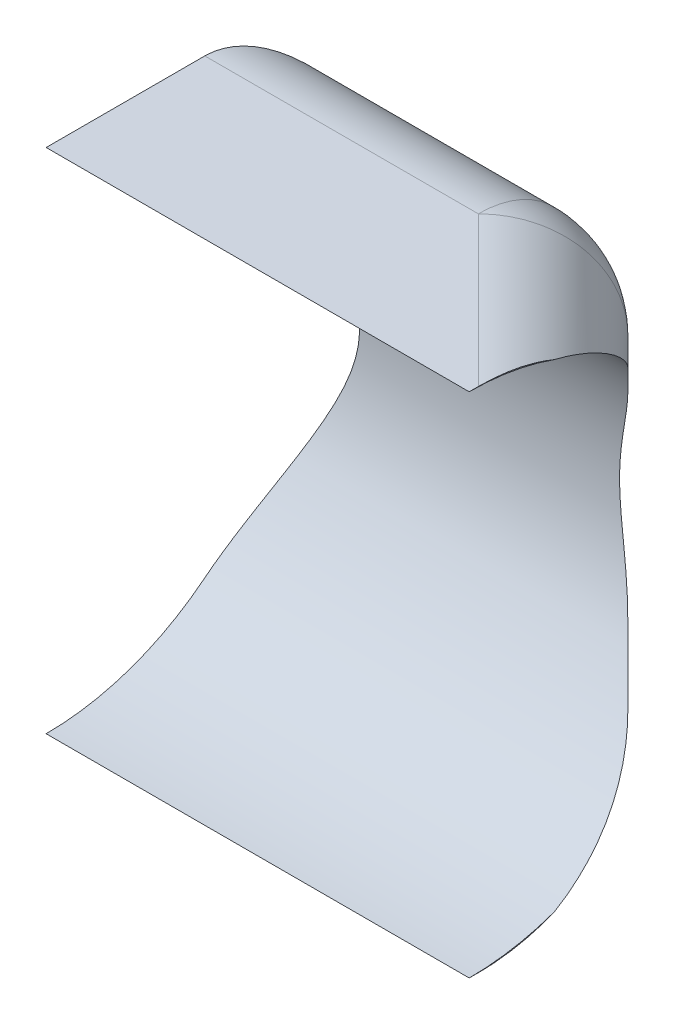
ISO-10303-21;
HEADER;
FILE_DESCRIPTION(('STEP AP214'),'2;1');
FILE_NAME('part.step','',(''),(''),'','','');
FILE_SCHEMA(('AUTOMOTIVE_DESIGN { 1 0 10303 214 1 1 1 1 }'));
ENDSEC;
DATA;
#1=APPLICATION_CONTEXT('core data for automotive mechanical design processes');
#2=APPLICATION_PROTOCOL_DEFINITION('international standard','automotive_design',2000,#1);
#3=PRODUCT_CONTEXT('',#1,'mechanical');
#4=PRODUCT('Part','Part','',(#3));
#5=PRODUCT_RELATED_PRODUCT_CATEGORY('part','',(#4));
#6=PRODUCT_DEFINITION_FORMATION('','',#4);
#7=PRODUCT_DEFINITION_CONTEXT('part definition',#1,'design');
#8=PRODUCT_DEFINITION('design','',#6,#7);
#9=PRODUCT_DEFINITION_SHAPE('','',#8);
#10=(LENGTH_UNIT() NAMED_UNIT(*) SI_UNIT(.MILLI.,.METRE.));
#11=(NAMED_UNIT(*) PLANE_ANGLE_UNIT() SI_UNIT($,.RADIAN.));
#12=(NAMED_UNIT(*) SI_UNIT($,.STERADIAN.) SOLID_ANGLE_UNIT());
#13=UNCERTAINTY_MEASURE_WITH_UNIT(LENGTH_MEASURE(1.E-05),#10,'distance_accuracy_value','');
#14=(GEOMETRIC_REPRESENTATION_CONTEXT(3) GLOBAL_UNCERTAINTY_ASSIGNED_CONTEXT((#13)) GLOBAL_UNIT_ASSIGNED_CONTEXT((#10,
#11,#12)) REPRESENTATION_CONTEXT('',''));
#15=CARTESIAN_POINT('',(0.,0.,0.));
#16=DIRECTION('',(0.,0.,1.));
#17=DIRECTION('',(1.,0.,0.));
#18=AXIS2_PLACEMENT_3D('',#15,#16,#17);
#19=CARTESIAN_POINT('',(40.,0.,10.0000000000002));
#20=DIRECTION('',(-0.707106781186551,0.,0.707106781186544));
#21=DIRECTION('',(0.,1.,0.));
#22=AXIS2_PLACEMENT_3D('',#19,#20,#21);
#23=PLANE('',#22);
#24=DIRECTION('',(0.707106781186544,0.,0.707106781186551));
#25=VECTOR('',#24,1.);
#26=CARTESIAN_POINT('',(29.9999999999999,-38.,0.));
#27=LINE('',#26,#25);
#28=CARTESIAN_POINT('',(35.5064113103819,-38.,5.50641131038207));
#29=VERTEX_POINT('',#28);
#30=CARTESIAN_POINT('',(32.9289321881345,-38.,2.92893218813456));
#31=VERTEX_POINT('',#30);
#32=EDGE_CURVE('E209',#29,#31,#27,.F.);
#33=ORIENTED_EDGE('',*,*,#32,.T.);
#34=DIRECTION('',(0.,-1.,0.));
#35=VECTOR('',#34,1.);
#36=CARTESIAN_POINT('',(32.9289321881345,-10.,2.92893218813456));
#37=LINE('',#36,#35);
#38=CARTESIAN_POINT('',(32.9289321881345,-33.4269807278914,2.92893218813456));
#39=VERTEX_POINT('',#38);
#40=EDGE_CURVE('E239',#31,#39,#37,.F.);
#41=ORIENTED_EDGE('',*,*,#40,.T.);
#42=CARTESIAN_POINT('',(54.9999999999997,-24.,25.));
#43=DIRECTION('',(-0.707106781186551,0.,0.707106781186544));
#44=DIRECTION('',(0.707106781186544,0.,0.707106781186551));
#45=AXIS2_PLACEMENT_3D('',#42,#43,#44);
#46=ELLIPSE('',#45,33.9411254969541,24.);
#47=EDGE_CURVE('E302',#29,#39,#46,.F.);
#48=ORIENTED_EDGE('',*,*,#47,.F.);
#49=EDGE_LOOP('',(#33,#41,#48));
#50=FACE_BOUND('',#49,.T.);
#51=ADVANCED_FACE('F37',(#50),#23,.F.);
#52=CARTESIAN_POINT('',(40.,0.,25.));
#53=DIRECTION('',(-1.,0.,0.));
#54=DIRECTION('',(0.,-1.,0.));
#55=AXIS2_PLACEMENT_3D('',#52,#53,#54);
#56=PLANE('',#55);
#57=DIRECTION('',(0.,0.,-1.));
#58=VECTOR('',#57,1.);
#59=CARTESIAN_POINT('',(40.,-48.,25.));
#60=LINE('',#59,#58);
#61=CARTESIAN_POINT('',(40.,-48.,25.));
#62=VERTEX_POINT('',#61);
#63=CARTESIAN_POINT('',(40.,-48.,24.1421356237312));
#64=VERTEX_POINT('',#63);
#65=EDGE_CURVE('E155',#62,#64,#60,.T.);
#66=ORIENTED_EDGE('',*,*,#65,.T.);
#67=CARTESIAN_POINT('',(40.,-38.,24.1421356237312));
#68=DIRECTION('',(-1.,0.,0.));
#69=DIRECTION('',(0.,0.,1.));
#70=AXIS2_PLACEMENT_3D('',#67,#68,#69);
#71=ELLIPSE('',#70,14.142135623731,10.);
#72=CARTESIAN_POINT('',(40.,-46.606308582722,16.9405451634276));
#73=VERTEX_POINT('',#72);
#74=EDGE_CURVE('E210',#64,#73,#71,.F.);
#75=ORIENTED_EDGE('',*,*,#74,.T.);
#76=CARTESIAN_POINT('',(40.,-24.,25.));
#77=DIRECTION('',(1.,0.,0.));
#78=DIRECTION('',(0.,-1.,0.));
#79=AXIS2_PLACEMENT_3D('',#76,#77,#78);
#80=CIRCLE('',#79,24.);
#81=EDGE_CURVE('E138',#62,#73,#80,.T.);
#82=ORIENTED_EDGE('',*,*,#81,.F.);
#83=EDGE_LOOP('',(#66,#75,#82));
#84=FACE_BOUND('',#83,.T.);
#85=ADVANCED_FACE('F314',(#84),#56,.F.);
#86=CARTESIAN_POINT('',(0.,0.,25.));
#87=DIRECTION('',(1.,0.,0.));
#88=DIRECTION('',(0.,0.,-1.));
#89=AXIS2_PLACEMENT_3D('',#86,#87,#88);
#90=PLANE('',#89);
#91=DIRECTION('',(0.,0.,-1.));
#92=VECTOR('',#91,1.);
#93=CARTESIAN_POINT('',(0.,0.,25.));
#94=LINE('',#93,#92);
#95=CARTESIAN_POINT('',(0.,0.,25.));
#96=VERTEX_POINT('',#95);
#97=CARTESIAN_POINT('',(0.,0.,10.));
#98=VERTEX_POINT('',#97);
#99=EDGE_CURVE('E133',#96,#98,#94,.T.);
#100=ORIENTED_EDGE('',*,*,#99,.T.);
#101=DIRECTION('',(0.,-1.,0.));
#102=VECTOR('',#101,1.);
#103=CARTESIAN_POINT('',(0.,0.,10.));
#104=LINE('',#103,#102);
#105=CARTESIAN_POINT('',(0.,-5.26500600480482,10.));
#106=VERTEX_POINT('',#105);
#107=EDGE_CURVE('E135',#98,#106,#104,.T.);
#108=ORIENTED_EDGE('',*,*,#107,.T.);
#109=CARTESIAN_POINT('',(0.,-24.,25.));
#110=DIRECTION('',(1.,0.,0.));
#111=DIRECTION('',(0.,-1.,0.));
#112=AXIS2_PLACEMENT_3D('',#109,#110,#111);
#113=CIRCLE('',#112,24.);
#114=EDGE_CURVE('E129',#106,#96,#113,.T.);
#115=ORIENTED_EDGE('',*,*,#114,.T.);
#116=EDGE_LOOP('',(#100,#108,#115));
#117=FACE_BOUND('',#116,.T.);
#118=ADVANCED_FACE('F131',(#117),#90,.F.);
#119=CARTESIAN_POINT('',(0.,-48.,25.));
#120=VERTEX_POINT('',#119);
#121=CARTESIAN_POINT('',(0.,-42.7349939951952,10.));
#122=VERTEX_POINT('',#121);
#123=EDGE_CURVE('E137',#120,#122,#113,.T.);
#124=ORIENTED_EDGE('',*,*,#123,.T.);
#125=DIRECTION('',(0.,-1.,0.));
#126=VECTOR('',#125,1.);
#127=CARTESIAN_POINT('',(0.,0.,10.));
#128=LINE('',#127,#126);
#129=CARTESIAN_POINT('',(0.,-48.,10.));
#130=VERTEX_POINT('',#129);
#131=EDGE_CURVE('E164',#122,#130,#128,.T.);
#132=ORIENTED_EDGE('',*,*,#131,.T.);
#133=DIRECTION('',(0.,0.,-1.));
#134=VECTOR('',#133,1.);
#135=CARTESIAN_POINT('',(0.,-48.,25.));
#136=LINE('',#135,#134);
#137=EDGE_CURVE('E161',#120,#130,#136,.T.);
#138=ORIENTED_EDGE('',*,*,#137,.F.);
#139=EDGE_LOOP('',(#124,#132,#138));
#140=FACE_BOUND('',#139,.T.);
#141=ADVANCED_FACE('F271',(#140),#90,.F.);
#142=CARTESIAN_POINT('',(0.,-48.,25.));
#143=DIRECTION('',(0.,1.,0.));
#144=DIRECTION('',(0.,0.,1.));
#145=AXIS2_PLACEMENT_3D('',#142,#143,#144);
#146=PLANE('',#145);
#147=ORIENTED_EDGE('',*,*,#137,.T.);
#148=DIRECTION('',(1.,0.,0.));
#149=VECTOR('',#148,1.);
#150=CARTESIAN_POINT('',(0.,-48.,10.));
#151=LINE('',#150,#149);
#152=CARTESIAN_POINT('',(25.8578643762689,-48.,10.));
#153=VERTEX_POINT('',#152);
#154=EDGE_CURVE('E242',#130,#153,#151,.T.);
#155=ORIENTED_EDGE('',*,*,#154,.T.);
#156=DIRECTION('',(-0.707106781186544,0.,-0.707106781186551));
#157=VECTOR('',#156,1.);
#158=CARTESIAN_POINT('',(32.9289321881345,-48.,17.0710678118656));
#159=LINE('',#158,#157);
#160=EDGE_CURVE('E285',#153,#64,#159,.F.);
#161=ORIENTED_EDGE('',*,*,#160,.T.);
#162=ORIENTED_EDGE('',*,*,#65,.F.);
#163=DIRECTION('',(1.,0.,0.));
#164=VECTOR('',#163,1.);
#165=CARTESIAN_POINT('',(0.,-48.,25.));
#166=LINE('',#165,#164);
#167=EDGE_CURVE('E149',#120,#62,#166,.T.);
#168=ORIENTED_EDGE('',*,*,#167,.F.);
#169=EDGE_LOOP('',(#147,#155,#161,#162,#168));
#170=FACE_BOUND('',#169,.T.);
#171=ADVANCED_FACE('F283',(#170),#146,.F.);
#172=CARTESIAN_POINT('',(40.,-1.39369141727854,16.9405451634263));
#173=VERTEX_POINT('',#172);
#174=CARTESIAN_POINT('',(40.,0.,25.));
#175=VERTEX_POINT('',#174);
#176=EDGE_CURVE('E145',#173,#175,#80,.T.);
#177=ORIENTED_EDGE('',*,*,#176,.F.);
#178=CARTESIAN_POINT('',(40.,-10.,24.1421356237312));
#179=DIRECTION('',(-1.,0.,0.));
#180=DIRECTION('',(0.,0.,-1.));
#181=AXIS2_PLACEMENT_3D('',#178,#179,#180);
#182=ELLIPSE('',#181,14.142135623731,10.);
#183=CARTESIAN_POINT('',(40.,0.,24.1421356237312));
#184=VERTEX_POINT('',#183);
#185=EDGE_CURVE('E293',#173,#184,#182,.F.);
#186=ORIENTED_EDGE('',*,*,#185,.T.);
#187=DIRECTION('',(0.,0.,-1.));
#188=VECTOR('',#187,1.);
#189=CARTESIAN_POINT('',(40.,0.,25.));
#190=LINE('',#189,#188);
#191=EDGE_CURVE('E153',#175,#184,#190,.T.);
#192=ORIENTED_EDGE('',*,*,#191,.F.);
#193=EDGE_LOOP('',(#177,#186,#192));
#194=FACE_BOUND('',#193,.T.);
#195=ADVANCED_FACE('F321',(#194),#56,.F.);
#196=CARTESIAN_POINT('',(0.,0.,25.));
#197=DIRECTION('',(0.,-1.,0.));
#198=DIRECTION('',(0.,0.,-1.));
#199=AXIS2_PLACEMENT_3D('',#196,#197,#198);
#200=PLANE('',#199);
#201=DIRECTION('',(0.707106781186544,0.,0.707106781186551));
#202=VECTOR('',#201,1.);
#203=CARTESIAN_POINT('',(22.9289321881344,0.,7.07106781186544));
#204=LINE('',#203,#202);
#205=CARTESIAN_POINT('',(25.8578643762689,0.,10.));
#206=VERTEX_POINT('',#205);
#207=EDGE_CURVE('E305',#184,#206,#204,.F.);
#208=ORIENTED_EDGE('',*,*,#207,.T.);
#209=DIRECTION('',(-1.,0.,0.));
#210=VECTOR('',#209,1.);
#211=CARTESIAN_POINT('',(0.,0.,10.));
#212=LINE('',#211,#210);
#213=EDGE_CURVE('E45',#206,#98,#212,.T.);
#214=ORIENTED_EDGE('',*,*,#213,.T.);
#215=ORIENTED_EDGE('',*,*,#99,.F.);
#216=DIRECTION('',(-1.,0.,0.));
#217=VECTOR('',#216,1.);
#218=CARTESIAN_POINT('',(0.,0.,25.));
#219=LINE('',#218,#217);
#220=EDGE_CURVE('E141',#175,#96,#219,.T.);
#221=ORIENTED_EDGE('',*,*,#220,.F.);
#222=ORIENTED_EDGE('',*,*,#191,.T.);
#223=EDGE_LOOP('',(#208,#214,#215,#221,#222));
#224=FACE_BOUND('',#223,.T.);
#225=ADVANCED_FACE('F151',(#224),#200,.F.);
#226=CARTESIAN_POINT('',(0.,0.,0.));
#227=DIRECTION('',(0.,0.,1.));
#228=DIRECTION('',(1.,0.,0.));
#229=AXIS2_PLACEMENT_3D('',#226,#227,#228);
#230=PLANE('',#229);
#231=CARTESIAN_POINT('',(17.9289321881345,-24.,0.));
#232=DIRECTION('',(0.,0.,1.));
#233=DIRECTION('',(1.,0.,0.));
#234=AXIS2_PLACEMENT_3D('',#231,#232,#233);
#235=CIRCLE('',#234,5.);
#236=CARTESIAN_POINT('',(22.9289321881345,-24.,0.));
#237=VERTEX_POINT('',#236);
#238=EDGE_CURVE('E11',#237,#237,#235,.F.);
#239=ORIENTED_EDGE('',*,*,#238,.F.);
#240=EDGE_LOOP('',(#239));
#241=FACE_BOUND('',#240,.T.);
#242=DIRECTION('',(0.,1.,0.));
#243=VECTOR('',#242,1.);
#244=CARTESIAN_POINT('',(25.857864376269,-38.,0.));
#245=LINE('',#244,#243);
#246=CARTESIAN_POINT('',(25.8578643762689,-10.,0.));
#247=VERTEX_POINT('',#246);
#248=CARTESIAN_POINT('',(25.857864376269,-38.,0.));
#249=VERTEX_POINT('',#248);
#250=EDGE_CURVE('E296',#247,#249,#245,.F.);
#251=ORIENTED_EDGE('',*,*,#250,.T.);
#252=DIRECTION('',(1.,0.,0.));
#253=VECTOR('',#252,1.);
#254=CARTESIAN_POINT('',(0.,-38.,0.));
#255=LINE('',#254,#253);
#256=CARTESIAN_POINT('',(10.,-38.,0.));
#257=VERTEX_POINT('',#256);
#258=EDGE_CURVE('E279',#249,#257,#255,.F.);
#259=ORIENTED_EDGE('',*,*,#258,.T.);
#260=DIRECTION('',(0.,-1.,0.));
#261=VECTOR('',#260,1.);
#262=CARTESIAN_POINT('',(10.,0.,0.));
#263=LINE('',#262,#261);
#264=CARTESIAN_POINT('',(10.,-10.,0.));
#265=VERTEX_POINT('',#264);
#266=EDGE_CURVE('E175',#257,#265,#263,.F.);
#267=ORIENTED_EDGE('',*,*,#266,.T.);
#268=DIRECTION('',(-1.,0.,0.));
#269=VECTOR('',#268,1.);
#270=CARTESIAN_POINT('',(0.,-10.,0.));
#271=LINE('',#270,#269);
#272=EDGE_CURVE('E295',#265,#247,#271,.F.);
#273=ORIENTED_EDGE('',*,*,#272,.T.);
#274=EDGE_LOOP('',(#251,#259,#267,#273));
#275=FACE_BOUND('',#274,.T.);
#276=ADVANCED_FACE('F185',(#241,#275),#230,.F.);
#277=CARTESIAN_POINT('',(0.,-24.,25.));
#278=DIRECTION('',(1.,0.,0.));
#279=DIRECTION('',(0.,1.,0.));
#280=AXIS2_PLACEMENT_3D('',#277,#278,#279);
#281=CYLINDRICAL_SURFACE('',#280,24.);
#282=ORIENTED_EDGE('',*,*,#47,.T.);
#283=CARTESIAN_POINT('',(32.9289321881345,-33.4269807278915,2.92893218813456));
#284=CARTESIAN_POINT('',(32.8271329097532,-33.188588504213,2.82711807834623));
#285=CARTESIAN_POINT('',(32.7248337224918,-32.9487334808352,2.72923062427731));
#286=CARTESIAN_POINT('',(32.520193896018,-32.4659766100525,2.54127270448154));
#287=CARTESIAN_POINT('',(32.4178532545388,-32.2230745651148,2.45120274857776));
#288=CARTESIAN_POINT('',(32.2137419905237,-31.733268582962,2.27855190161104));
#289=CARTESIAN_POINT('',(32.1119746654923,-31.4863535280337,2.19599863263588));
#290=CARTESIAN_POINT('',(31.9105305691383,-30.9891938296239,2.03874676631367));
#291=CARTESIAN_POINT('',(31.8108537586694,-30.7389492486334,1.96404802178074));
#292=CARTESIAN_POINT('',(31.6118479267749,-30.2269755164486,1.82031757972945));
#293=CARTESIAN_POINT('',(31.5126284245789,-29.9651326870697,1.75153798095842));
#294=CARTESIAN_POINT('',(31.319603478024,-29.4373923599183,1.62247760525228));
#295=CARTESIAN_POINT('',(31.2257977092619,-29.1714951063056,1.56219631876579));
#296=CARTESIAN_POINT('',(31.0458300795816,-28.6356869755569,1.45036727790365));
#297=CARTESIAN_POINT('',(30.9596583995698,-28.3657817912861,1.39880822481741));
#298=CARTESIAN_POINT('',(30.7973581022885,-27.8214745820247,1.30458689616222));
#299=CARTESIAN_POINT('',(30.7212273587771,-27.5470735229489,1.26192273591971));
#300=CARTESIAN_POINT('',(30.5689633486335,-26.9423996767947,1.17875215635276));
#301=CARTESIAN_POINT('',(30.4954429025372,-26.6111945096894,1.14011001298408));
#302=CARTESIAN_POINT('',(30.3717278909255,-25.9431294561521,1.07643957527415));
#303=CARTESIAN_POINT('',(30.3215281076734,-25.606270852106,1.05140823545449));
#304=CARTESIAN_POINT('',(30.2494487803043,-24.9331530547882,1.0158122958291));
#305=CARTESIAN_POINT('',(30.2272075559737,-24.5969436045016,1.00506283542024));
#306=CARTESIAN_POINT('',(30.2121469827101,-23.9237017438229,0.997760909898105));
#307=CARTESIAN_POINT('',(30.219326491263,-23.5866693658961,1.00120789348532));
#308=CARTESIAN_POINT('',(30.262301019486,-22.9154899839812,1.02216786589501));
#309=CARTESIAN_POINT('',(30.298049381879,-22.581339172612,1.0396579204683));
#310=CARTESIAN_POINT('',(30.3946507613719,-21.9177160661213,1.08818539303226));
#311=CARTESIAN_POINT('',(30.4555094888187,-21.5882448528276,1.11922589262218));
#312=CARTESIAN_POINT('',(30.598408985083,-20.9312743056624,1.19467186024196));
#313=CARTESIAN_POINT('',(30.6807019647998,-20.6038495223493,1.23923758404605));
#314=CARTESIAN_POINT('',(30.8610980570349,-19.9553450217789,1.34099423644651));
#315=CARTESIAN_POINT('',(30.9592068022933,-19.6342676110271,1.39818966577029));
#316=CARTESIAN_POINT('',(31.1997549538539,-18.8972632394805,1.54483705497679));
#317=CARTESIAN_POINT('',(31.3463771071436,-18.4836018852926,1.63876429431312));
#318=CARTESIAN_POINT('',(31.6513541833573,-17.6658323050783,1.84710785177903));
#319=CARTESIAN_POINT('',(31.8097128967353,-17.2617272214272,1.96153080628374));
#320=CARTESIAN_POINT('',(32.1280142330554,-16.4724700644875,2.20739903498151));
#321=CARTESIAN_POINT('',(32.2878103475166,-16.0870980377461,2.33832841969417));
#322=CARTESIAN_POINT('',(32.5283117991787,-15.5149225590136,2.54906007340941));
#323=CARTESIAN_POINT('',(32.6085811996764,-15.3252525839467,2.62166162309101));
#324=CARTESIAN_POINT('',(32.7689747852565,-14.9477622013626,2.77167973495386));
#325=CARTESIAN_POINT('',(32.8490989689936,-14.7599418109092,2.84909634150942));
#326=CARTESIAN_POINT('',(32.9289321881345,-14.5730192721085,2.92893218813456));
#327=B_SPLINE_CURVE_WITH_KNOTS('',3,(#283,#284,#285,#286,#287,#288,#289,#290,#291,#292,#293,
#294,#295,#296,#297,#298,#299,#300,#301,#302,#303,#304,#305,#306,#307,#308,#309,#310,#311,#312,
#313,#314,#315,#316,#317,#318,#319,#320,#321,#322,#323,#324,#325,#326),.UNSPECIFIED.,.F.,.F.,(4,
2,2,2,2,2,2,2,2,2,2,2,2,2,2,2,2,2,2,2,2,4),(0.,0.835455824701549,1.67096609330822,
2.50943222562282,3.34788264312528,4.21270114558908,5.0774677722175,5.94110546379641,
6.80455997913367,7.82798984363461,8.85119061677689,9.86101398611723,10.8707981407162,
11.878936526304,12.8873042990629,13.9081200342726,14.9293001365932,16.2748334548629,
17.6208032379548,18.9320147658029,19.5870962232944,20.242183718741),.UNSPECIFIED.);
#328=CARTESIAN_POINT('',(32.9289321881345,-14.5730192721085,2.92893218813456));
#329=VERTEX_POINT('',#328);
#330=EDGE_CURVE('E233',#39,#329,#327,.T.);
#331=ORIENTED_EDGE('',*,*,#330,.T.);
#332=CARTESIAN_POINT('',(35.506411310382,-9.99999999999999,5.50641131038208));
#333=VERTEX_POINT('',#332);
#334=EDGE_CURVE('E306',#329,#333,#46,.F.);
#335=ORIENTED_EDGE('',*,*,#334,.T.);
#336=CARTESIAN_POINT('',(35.506411310382,-10.,5.50641131038208));
#337=CARTESIAN_POINT('',(35.6532624196961,-9.79552822155345,5.65324780032356));
#338=CARTESIAN_POINT('',(35.7958834032534,-9.59138016732507,5.80475185426832));
#339=CARTESIAN_POINT('',(36.072837410956,-9.18454527963962,6.11699363570935));
#340=CARTESIAN_POINT('',(36.2071707819397,-8.98185838534664,6.27773097624616));
#341=CARTESIAN_POINT('',(36.467684858142,-8.57881855193055,6.60828767602814));
#342=CARTESIAN_POINT('',(36.593868627233,-8.37846475916508,6.7781035777502));
#343=CARTESIAN_POINT('',(36.8383494723712,-7.9807916152201,7.1266980875843));
#344=CARTESIAN_POINT('',(36.9566464950609,-7.78347228457708,7.3054767563193));
#345=CARTESIAN_POINT('',(37.2996447027307,-7.19788696996011,7.85431331232045));
#346=CARTESIAN_POINT('',(37.5129842285691,-6.81516276359719,8.23754973356176));
#347=CARTESIAN_POINT('',(37.9113776654531,-6.07010546607034,9.03699209231533));
#348=CARTESIAN_POINT('',(38.096430900266,-5.70777286253368,9.4531988176786));
#349=CARTESIAN_POINT('',(38.4425342325927,-5.00450555833965,10.3205567765344));
#350=CARTESIAN_POINT('',(38.6033195444588,-4.66382753970209,10.7720218087876));
#351=CARTESIAN_POINT('',(38.9013426920877,-4.01202032526758,11.703242790542));
#352=CARTESIAN_POINT('',(39.0385772286889,-3.70089527218326,12.1830026911631));
#353=CARTESIAN_POINT('',(39.2921274056068,-3.11207760655291,13.1668695733218));
#354=CARTESIAN_POINT('',(39.4084726629278,-2.83433784781573,13.6709407780043));
#355=CARTESIAN_POINT('',(39.6233109110961,-2.31463836424119,14.700611277251));
#356=CARTESIAN_POINT('',(39.7218124834855,-2.07266145038741,15.226200073478));
#357=CARTESIAN_POINT('',(39.8459200005576,-1.76856629713414,15.9552333570958));
#358=CARTESIAN_POINT('',(39.8780269616263,-1.6899784124702,16.1508499533247));
#359=CARTESIAN_POINT('',(39.9403701041884,-1.53796979522194,16.544139835411));
#360=CARTESIAN_POINT('',(39.9706081718831,-1.46454384225938,16.7418108043944));
#361=CARTESIAN_POINT('',(40.0000000000008,-1.39369141727565,16.9405451634343));
#362=B_SPLINE_CURVE_WITH_KNOTS('',3,(#336,#337,#338,#339,#340,#341,#342,#343,#344,#345,#346,
#347,#348,#349,#350,#351,#352,#353,#354,#355,#356,#357,#358,#359,#360,#361),.UNSPECIFIED.,.F.,
.F.,(4,2,2,2,2,2,2,2,2,2,2,2,4),(0.,0.874228757244908,1.74842090297332,2.62228245653633,
3.49614992157995,5.24030597614305,6.98450372124821,8.74653627353613,10.5088154628391,
12.2685759997415,14.0274879571576,14.66715788503,15.3061713061076),.UNSPECIFIED.);
#363=EDGE_CURVE('E194',#333,#173,#362,.T.);
#364=ORIENTED_EDGE('',*,*,#363,.T.);
#365=ORIENTED_EDGE('',*,*,#176,.T.);
#366=ORIENTED_EDGE('',*,*,#220,.T.);
#367=ORIENTED_EDGE('',*,*,#114,.F.);
#368=CARTESIAN_POINT('',(0.,-5.26500600480482,10.));
#369=CARTESIAN_POINT('',(2.38873575207352E-06,-5.39847029524447,9.83329794291311));
#370=CARTESIAN_POINT('',(0.00416818968142715,-5.53413766249448,9.66841573849683));
#371=CARTESIAN_POINT('',(0.0202997976870632,-5.80959568412448,9.34258435748846));
#372=CARTESIAN_POINT('',(0.0322637851684078,-5.94938536936639,9.18163427248787));
#373=CARTESIAN_POINT('',(0.0790092095804187,-6.3740904120216,8.70558758971699));
#374=CARTESIAN_POINT('',(0.124648009953924,-6.66483162124302,8.39668319509968));
#375=CARTESIAN_POINT('',(0.240284454581408,-7.25664945572709,7.80014293693774));
#376=CARTESIAN_POINT('',(0.310032536352604,-7.55759275070588,7.51232443751708));
#377=CARTESIAN_POINT('',(0.470409522172528,-8.1710389717957,6.95517227897837));
#378=CARTESIAN_POINT('',(0.561050176433757,-8.48354831944484,6.68584913289951));
#379=CARTESIAN_POINT('',(0.80949285047694,-9.27696245652269,6.0366093605622));
#380=CARTESIAN_POINT('',(0.978248016840273,-9.76413837007112,5.66850553573499));
#381=CARTESIAN_POINT('',(1.34531360241092,-10.7573556837906,4.97502471358942));
#382=CARTESIAN_POINT('',(1.54363530780322,-11.2634042324983,4.64966412189436));
#383=CARTESIAN_POINT('',(1.9624177487377,-12.2956234962492,4.03884966290781));
#384=CARTESIAN_POINT('',(2.18302782330444,-12.8219130030566,3.75370049726918));
#385=CARTESIAN_POINT('',(2.63630461036338,-13.8898129019483,3.22526527500463));
#386=CARTESIAN_POINT('',(2.86896835228622,-14.4314195044058,2.98196896719687));
#387=CARTESIAN_POINT('',(3.3112372563477,-15.4702504149699,2.56069616020152));
#388=CARTESIAN_POINT('',(3.52059061309101,-15.9658751339681,2.37849000048249));
#389=CARTESIAN_POINT('',(3.93292305185322,-16.9707725919998,2.04634770301093));
#390=CARTESIAN_POINT('',(4.13589926368406,-17.4800512905099,1.89642592283353));
#391=CARTESIAN_POINT('',(4.52282193132964,-18.5109490294696,1.63009848173531));
#392=CARTESIAN_POINT('',(4.70687113655638,-19.0324802321792,1.51350498524047));
#393=CARTESIAN_POINT('',(5.04089876767881,-20.0926436339531,1.31408173172236));
#394=CARTESIAN_POINT('',(5.19091413741033,-20.6312565595657,1.231215285513));
#395=CARTESIAN_POINT('',(5.38704637670754,-21.5104419470068,1.12713047480548));
#396=CARTESIAN_POINT('',(5.45082730763865,-21.84568303491,1.09448263814253));
#397=CARTESIAN_POINT('',(5.55260882980391,-22.5211322025116,1.04321519662957));
#398=CARTESIAN_POINT('',(5.59061840792381,-22.8613385084396,1.02459070136395));
#399=CARTESIAN_POINT('',(5.63702036377499,-23.543032027531,1.00193778888614));
#400=CARTESIAN_POINT('',(5.64552330709339,-23.8845096484898,0.997854880744976));
#401=CARTESIAN_POINT('',(5.63230026925525,-24.5667534428155,1.00426639906535));
#402=CARTESIAN_POINT('',(5.6105702393892,-24.9075195147731,1.01476277794117));
#403=CARTESIAN_POINT('',(5.53134782934385,-25.6592050621325,1.05385517803984));
#404=CARTESIAN_POINT('',(5.46709166517431,-26.0692225488342,1.08589824034215));
#405=CARTESIAN_POINT('',(5.30541407648988,-26.8805454523116,1.16999429949535));
#406=CARTESIAN_POINT('',(5.20797106737266,-27.2818450178248,1.22206032206014));
#407=CARTESIAN_POINT('',(4.98828663971839,-28.0783656378021,1.34559509017217));
#408=CARTESIAN_POINT('',(4.86582854851945,-28.4734986822657,1.41723534865594));
#409=CARTESIAN_POINT('',(4.6048215435164,-29.2544456117769,1.57885949646728));
#410=CARTESIAN_POINT('',(4.46627366099328,-29.6402600921886,1.66884221040743));
#411=CARTESIAN_POINT('',(4.19201792874531,-30.3699078819341,1.85797115072984));
#412=CARTESIAN_POINT('',(4.05713403764157,-30.7144466234078,1.95561304024236));
#413=CARTESIAN_POINT('',(3.78288699623572,-31.39723972461,2.16563034596775));
#414=CARTESIAN_POINT('',(3.64352319654168,-31.7354931619261,2.27800790554806));
#415=CARTESIAN_POINT('',(3.36321191983381,-32.4063279974099,2.51754972758872));
#416=CARTESIAN_POINT('',(3.22226352433571,-32.7389057912596,2.64472301267829));
#417=CARTESIAN_POINT('',(2.9413245075348,-33.3984308891267,2.91388841608978));
#418=CARTESIAN_POINT('',(2.80133397069007,-33.7253777003984,3.05588182366494));
#419=CARTESIAN_POINT('',(2.38698572604865,-34.6957737583948,3.50332385564585));
#420=CARTESIAN_POINT('',(2.11724389195079,-35.3311128894017,3.8310669716738));
#421=CARTESIAN_POINT('',(1.60582497010438,-36.5779372814924,4.54733621634053));
#422=CARTESIAN_POINT('',(1.36412348176415,-37.1894429698686,4.93580879670702));
#423=CARTESIAN_POINT('',(1.00522259961899,-38.1644847739521,5.62011576709436));
#424=CARTESIAN_POINT('',(0.874969560902851,-38.5363441165373,5.89732064450589));
#425=CARTESIAN_POINT('',(0.636034033522782,-39.267657619574,6.47660487925353));
#426=CARTESIAN_POINT('',(0.527354711458786,-39.6271099525317,6.77868787901839));
#427=CARTESIAN_POINT('',(0.336727260567651,-40.3302192338671,7.40610426194317));
#428=CARTESIAN_POINT('',(0.254683892740556,-40.6739285983711,7.73134962180758));
#429=CARTESIAN_POINT('',(0.122102253713897,-41.3442786381497,8.40478206633376));
#430=CARTESIAN_POINT('',(0.0715366871548268,-41.6709338757332,8.75294898447426));
#431=CARTESIAN_POINT('',(0.026635698462732,-42.1155190489728,9.25625853968259));
#432=CARTESIAN_POINT('',(0.0167488010560559,-42.2418164321394,9.40276959924959));
#433=CARTESIAN_POINT('',(0.00343091514114229,-42.491011001588,9.69902027909639));
#434=CARTESIAN_POINT('',(1.99502668813417E-06,-42.6139070860713,9.84876091823592));
#435=CARTESIAN_POINT('',(0.,-42.7349939951952,10.));
#436=B_SPLINE_CURVE_WITH_KNOTS('',3,(#368,#369,#370,#371,#372,#373,#374,#375,#376,#377,#378,
#379,#380,#381,#382,#383,#384,#385,#386,#387,#388,#389,#390,#391,#392,#393,#394,#395,#396,#397,
#398,#399,#400,#401,#402,#403,#404,#405,#406,#407,#408,#409,#410,#411,#412,#413,#414,#415,#416,
#417,#418,#419,#420,#421,#422,#423,#424,#425,#426,#427,#428,#429,#430,#431,#432,#433,#434,#435),
.UNSPECIFIED.,.F.,.F.,(4,2,2,2,2,2,2,2,2,2,2,2,2,2,2,2,2,2,2,2,2,2,2,2,2,2,2,2,2,2,2,2,2,4),(0.,
0.640505554726595,1.28086171148761,2.55923206400596,3.82474738673841,5.09097619336766,
6.98855027913174,8.88685057330111,10.7988401916367,12.7103608301155,14.413462668459,
16.1173203566493,17.8113768608499,19.5035855677277,20.5309587331579,21.5579734525076,
22.5811356203465,23.6044348201977,24.8508245172953,26.0980264146934,27.3565278283743,
28.614948622426,29.7625719370692,30.9103623640768,32.0588564342828,33.2074504993314,
35.4966380123862,37.7838182999769,39.2279941136191,40.6723817475583,42.1115464737586,
43.5494615117243,44.1303818490999,44.7114882149728),.UNSPECIFIED.);
#437=EDGE_CURVE('E168',#106,#122,#436,.T.);
#438=ORIENTED_EDGE('',*,*,#437,.T.);
#439=ORIENTED_EDGE('',*,*,#123,.F.);
#440=ORIENTED_EDGE('',*,*,#167,.T.);
#441=ORIENTED_EDGE('',*,*,#81,.T.);
#442=CARTESIAN_POINT('',(40.,-46.606308582722,16.9405451634276));
#443=CARTESIAN_POINT('',(39.9549257539058,-46.4976605866554,16.6357719582332));
#444=CARTESIAN_POINT('',(39.907854483342,-46.3829284202721,16.3334611195965));
#445=CARTESIAN_POINT('',(39.8092227825354,-46.1416255400748,15.7343305773535));
#446=CARTESIAN_POINT('',(39.7576621416632,-46.0150542707805,15.4375111321821));
#447=CARTESIAN_POINT('',(39.6495449852854,-45.7503747000669,14.8498729325943));
#448=CARTESIAN_POINT('',(39.5929870189935,-45.6122630489661,14.559055951196));
#449=CARTESIAN_POINT('',(39.4744008286608,-45.3249557233751,13.9841212622389));
#450=CARTESIAN_POINT('',(39.4123727209251,-45.1757602845569,13.700003412407));
#451=CARTESIAN_POINT('',(39.221196863437,-44.7213755708228,12.8752157085722));
#452=CARTESIAN_POINT('',(39.0837710904522,-44.4013972886887,12.3444694209287));
#453=CARTESIAN_POINT('',(38.7828719109508,-43.7252840920888,11.3145085536024));
#454=CARTESIAN_POINT('',(38.6194030907348,-43.3691555478501,10.8152884435896));
#455=CARTESIAN_POINT('',(38.2661515178363,-42.6322728909348,9.86080390952305));
#456=CARTESIAN_POINT('',(38.0769031930859,-42.2520865204523,9.40490376238068));
#457=CARTESIAN_POINT('',(37.6667409196277,-41.4668052956191,8.53015015226802));
#458=CARTESIAN_POINT('',(37.4458273967914,-41.061710776305,8.11129619117868));
#459=CARTESIAN_POINT('',(37.0851213025527,-40.434074709865,7.50688188371934));
#460=CARTESIAN_POINT('',(36.9579197928439,-40.2182364718189,7.30666053212843));
#461=CARTESIAN_POINT('',(36.6940463453062,-39.7826089456525,6.91700801022222));
#462=CARTESIAN_POINT('',(36.5573744243736,-39.5628196645819,6.72757682065719));
#463=CARTESIAN_POINT('',(36.2741917392151,-39.1201945957345,6.35965254512226));
#464=CARTESIAN_POINT('',(36.1276756378139,-38.8973572083758,6.18116549462837));
#465=CARTESIAN_POINT('',(35.8246204082221,-38.4498116493124,5.83536862798081));
#466=CARTESIAN_POINT('',(35.668080774457,-38.225103383741,5.66805937649254));
#467=CARTESIAN_POINT('',(35.506411310382,-38.,5.50641131038208));
#468=B_SPLINE_CURVE_WITH_KNOTS('',3,(#442,#443,#444,#445,#446,#447,#448,#449,#450,#451,#452,
#453,#454,#455,#456,#457,#458,#459,#460,#461,#462,#463,#464,#465,#466,#467),.UNSPECIFIED.,.F.,
.F.,(4,2,2,2,2,2,2,2,2,2,2,2,4),(0.,0.97998317179168,1.9600123466298,2.94032697697132,
3.92062076905845,5.82251755215238,7.72407977192985,9.59095301239684,11.4578011472686,
12.4196438990749,13.3814849348927,14.3438517226814,15.3062670893528),.UNSPECIFIED.);
#469=EDGE_CURVE('E202',#73,#29,#468,.T.);
#470=ORIENTED_EDGE('',*,*,#469,.T.);
#471=EDGE_LOOP('',(#282,#331,#335,#364,#365,#366,#367,#438,#439,#440,#441,#470));
#472=FACE_BOUND('',#471,.T.);
#473=ADVANCED_FACE('F143',(#472),#281,.F.);
#474=CARTESIAN_POINT('',(10.,0.,10.));
#475=DIRECTION('',(0.,-1.,0.));
#476=DIRECTION('',(0.,0.,-1.));
#477=AXIS2_PLACEMENT_3D('',#474,#475,#476);
#478=CYLINDRICAL_SURFACE('',#477,10.);
#479=ORIENTED_EDGE('',*,*,#266,.F.);
#480=CARTESIAN_POINT('',(10.,-38.,10.));
#481=DIRECTION('',(0.707106781186547,-0.707106781186547,0.));
#482=DIRECTION('',(-0.707106781186547,-0.707106781186547,0.));
#483=AXIS2_PLACEMENT_3D('',#480,#481,#482);
#484=ELLIPSE('',#483,14.1421356237309,10.);
#485=EDGE_CURVE('E246',#257,#130,#484,.F.);
#486=ORIENTED_EDGE('',*,*,#485,.T.);
#487=ORIENTED_EDGE('',*,*,#131,.F.);
#488=ORIENTED_EDGE('',*,*,#437,.F.);
#489=ORIENTED_EDGE('',*,*,#107,.F.);
#490=CARTESIAN_POINT('',(10.,-10.,10.));
#491=DIRECTION('',(-0.707106781186547,-0.707106781186547,0.));
#492=DIRECTION('',(0.707106781186547,-0.707106781186547,0.));
#493=AXIS2_PLACEMENT_3D('',#490,#491,#492);
#494=ELLIPSE('',#493,14.1421356237309,10.);
#495=EDGE_CURVE('E244',#98,#265,#494,.T.);
#496=ORIENTED_EDGE('',*,*,#495,.T.);
#497=EDGE_LOOP('',(#479,#486,#487,#488,#489,#496));
#498=FACE_BOUND('',#497,.T.);
#499=ADVANCED_FACE('F177',(#498),#478,.T.);
#500=ORIENTED_EDGE('',*,*,#334,.F.);
#501=DIRECTION('',(0.,-1.,0.));
#502=VECTOR('',#501,1.);
#503=CARTESIAN_POINT('',(32.9289321881345,-10.,2.92893218813456));
#504=LINE('',#503,#502);
#505=CARTESIAN_POINT('',(32.9289321881345,-10.,2.92893218813456));
#506=VERTEX_POINT('',#505);
#507=EDGE_CURVE('E60',#329,#506,#504,.F.);
#508=ORIENTED_EDGE('',*,*,#507,.T.);
#509=DIRECTION('',(-0.707106781186544,0.,-0.707106781186551));
#510=VECTOR('',#509,1.);
#511=CARTESIAN_POINT('',(40.,-10.,10.0000000000002));
#512=LINE('',#511,#510);
#513=EDGE_CURVE('E327',#506,#333,#512,.F.);
#514=ORIENTED_EDGE('',*,*,#513,.T.);
#515=EDGE_LOOP('',(#500,#508,#514));
#516=FACE_BOUND('',#515,.T.);
#517=ADVANCED_FACE('F315',(#516),#23,.F.);
#518=CARTESIAN_POINT('',(20.4289321881346,-10.,4.5710678118656));
#519=DIRECTION('',(-0.707106781186544,0.,-0.707106781186551));
#520=DIRECTION('',(-0.707106781186551,0.,0.707106781186544));
#521=AXIS2_PLACEMENT_3D('',#518,#519,#520);
#522=CYLINDRICAL_SURFACE('',#521,10.);
#523=ORIENTED_EDGE('',*,*,#513,.F.);
#524=CARTESIAN_POINT('',(25.8578643762689,-10.,10.));
#525=DIRECTION('',(-0.707106781186544,0.,-0.707106781186551));
#526=DIRECTION('',(-0.707106781186551,0.,0.707106781186544));
#527=AXIS2_PLACEMENT_3D('',#524,#525,#526);
#528=CIRCLE('',#527,10.);
#529=EDGE_CURVE('E52',#506,#206,#528,.F.);
#530=ORIENTED_EDGE('',*,*,#529,.T.);
#531=ORIENTED_EDGE('',*,*,#207,.F.);
#532=ORIENTED_EDGE('',*,*,#185,.F.);
#533=ORIENTED_EDGE('',*,*,#363,.F.);
#534=EDGE_LOOP('',(#523,#530,#531,#532,#533));
#535=FACE_BOUND('',#534,.T.);
#536=ADVANCED_FACE('F217',(#535),#522,.T.);
#537=CARTESIAN_POINT('',(20.4289321881346,-38.,4.5710678118656));
#538=DIRECTION('',(0.707106781186544,0.,0.707106781186551));
#539=DIRECTION('',(0.707106781186551,0.,-0.707106781186544));
#540=AXIS2_PLACEMENT_3D('',#537,#538,#539);
#541=CYLINDRICAL_SURFACE('',#540,10.);
#542=ORIENTED_EDGE('',*,*,#160,.F.);
#543=CARTESIAN_POINT('',(25.857864376269,-38.,10.));
#544=DIRECTION('',(0.707106781186544,0.,0.707106781186551));
#545=DIRECTION('',(0.707106781186551,0.,-0.707106781186544));
#546=AXIS2_PLACEMENT_3D('',#543,#544,#545);
#547=CIRCLE('',#546,10.);
#548=EDGE_CURVE('E290',#153,#31,#547,.T.);
#549=ORIENTED_EDGE('',*,*,#548,.T.);
#550=ORIENTED_EDGE('',*,*,#32,.F.);
#551=ORIENTED_EDGE('',*,*,#469,.F.);
#552=ORIENTED_EDGE('',*,*,#74,.F.);
#553=EDGE_LOOP('',(#542,#549,#550,#551,#552));
#554=FACE_BOUND('',#553,.T.);
#555=ADVANCED_FACE('F213',(#554),#541,.T.);
#556=CARTESIAN_POINT('',(0.,-10.,10.));
#557=DIRECTION('',(-1.,0.,0.));
#558=DIRECTION('',(0.,0.,1.));
#559=AXIS2_PLACEMENT_3D('',#556,#557,#558);
#560=CYLINDRICAL_SURFACE('',#559,10.);
#561=ORIENTED_EDGE('',*,*,#495,.F.);
#562=ORIENTED_EDGE('',*,*,#213,.F.);
#563=CARTESIAN_POINT('',(25.8578643762689,-10.,10.));
#564=DIRECTION('',(1.,0.,0.));
#565=DIRECTION('',(0.,0.,-1.));
#566=AXIS2_PLACEMENT_3D('',#563,#564,#565);
#567=CIRCLE('',#566,10.);
#568=EDGE_CURVE('E257',#247,#206,#567,.T.);
#569=ORIENTED_EDGE('',*,*,#568,.F.);
#570=ORIENTED_EDGE('',*,*,#272,.F.);
#571=EDGE_LOOP('',(#561,#562,#569,#570));
#572=FACE_BOUND('',#571,.T.);
#573=ADVANCED_FACE('F39',(#572),#560,.T.);
#574=CARTESIAN_POINT('',(25.8578643762689,-10.,10.));
#575=DIRECTION('',(0.,0.,1.));
#576=DIRECTION('',(1.,0.,0.));
#577=AXIS2_PLACEMENT_3D('',#574,#575,#576);
#578=SPHERICAL_SURFACE('',#577,10.);
#579=ORIENTED_EDGE('',*,*,#568,.T.);
#580=ORIENTED_EDGE('',*,*,#529,.F.);
#581=CARTESIAN_POINT('',(25.8578643762689,-10.,10.));
#582=DIRECTION('',(0.,-1.,0.));
#583=DIRECTION('',(1.,0.,0.));
#584=AXIS2_PLACEMENT_3D('',#581,#582,#583);
#585=CIRCLE('',#584,10.);
#586=EDGE_CURVE('E255',#247,#506,#585,.T.);
#587=ORIENTED_EDGE('',*,*,#586,.F.);
#588=EDGE_LOOP('',(#579,#580,#587));
#589=FACE_BOUND('',#588,.T.);
#590=ADVANCED_FACE('F231',(#589),#578,.T.);
#591=CARTESIAN_POINT('',(25.8578643762689,0.,10.));
#592=DIRECTION('',(0.,-1.,0.));
#593=DIRECTION('',(1.,0.,0.));
#594=AXIS2_PLACEMENT_3D('',#591,#592,#593);
#595=CYLINDRICAL_SURFACE('',#594,10.);
#596=ORIENTED_EDGE('',*,*,#330,.F.);
#597=ORIENTED_EDGE('',*,*,#40,.F.);
#598=CARTESIAN_POINT('',(25.857864376269,-38.,10.));
#599=DIRECTION('',(0.,-1.,0.));
#600=DIRECTION('',(0.,0.,-1.));
#601=AXIS2_PLACEMENT_3D('',#598,#599,#600);
#602=CIRCLE('',#601,10.);
#603=EDGE_CURVE('E252',#249,#31,#602,.T.);
#604=ORIENTED_EDGE('',*,*,#603,.F.);
#605=ORIENTED_EDGE('',*,*,#250,.F.);
#606=ORIENTED_EDGE('',*,*,#586,.T.);
#607=ORIENTED_EDGE('',*,*,#507,.F.);
#608=EDGE_LOOP('',(#596,#597,#604,#605,#606,#607));
#609=FACE_BOUND('',#608,.T.);
#610=ADVANCED_FACE('F227',(#609),#595,.T.);
#611=CARTESIAN_POINT('',(0.,-38.,10.));
#612=DIRECTION('',(1.,0.,0.));
#613=DIRECTION('',(0.,0.,-1.));
#614=AXIS2_PLACEMENT_3D('',#611,#612,#613);
#615=CYLINDRICAL_SURFACE('',#614,10.);
#616=ORIENTED_EDGE('',*,*,#485,.F.);
#617=ORIENTED_EDGE('',*,*,#258,.F.);
#618=CARTESIAN_POINT('',(25.8578643762689,-38.,10.));
#619=DIRECTION('',(1.,0.,0.));
#620=DIRECTION('',(0.,0.,-1.));
#621=AXIS2_PLACEMENT_3D('',#618,#619,#620);
#622=CIRCLE('',#621,10.);
#623=EDGE_CURVE('E249',#153,#249,#622,.T.);
#624=ORIENTED_EDGE('',*,*,#623,.F.);
#625=ORIENTED_EDGE('',*,*,#154,.F.);
#626=EDGE_LOOP('',(#616,#617,#624,#625));
#627=FACE_BOUND('',#626,.T.);
#628=ADVANCED_FACE('F223',(#627),#615,.T.);
#629=CARTESIAN_POINT('',(25.857864376269,-38.,10.));
#630=DIRECTION('',(0.,0.,1.));
#631=DIRECTION('',(1.,0.,0.));
#632=AXIS2_PLACEMENT_3D('',#629,#630,#631);
#633=SPHERICAL_SURFACE('',#632,10.);
#634=ORIENTED_EDGE('',*,*,#603,.T.);
#635=ORIENTED_EDGE('',*,*,#548,.F.);
#636=ORIENTED_EDGE('',*,*,#623,.T.);
#637=EDGE_LOOP('',(#634,#635,#636));
#638=FACE_BOUND('',#637,.T.);
#639=ADVANCED_FACE('F220',(#638),#633,.T.);
#640=CARTESIAN_POINT('',(17.9289321881345,-24.,-2.));
#641=DIRECTION('',(0.,0.,1.));
#642=DIRECTION('',(1.,0.,0.));
#643=AXIS2_PLACEMENT_3D('',#640,#641,#642);
#644=CYLINDRICAL_SURFACE('',#643,5.);
#645=CARTESIAN_POINT('',(17.9289321881345,-24.,-2.));
#646=DIRECTION('',(0.,0.,-1.));
#647=DIRECTION('',(-1.,0.,0.));
#648=AXIS2_PLACEMENT_3D('',#645,#646,#647);
#649=CIRCLE('',#648,5.);
#650=CARTESIAN_POINT('',(12.9289321881345,-24.,-2.));
#651=VERTEX_POINT('',#650);
#652=EDGE_CURVE('E253',#651,#651,#649,.T.);
#653=ORIENTED_EDGE('',*,*,#652,.F.);
#654=EDGE_LOOP('',(#653));
#655=FACE_BOUND('',#654,.T.);
#656=ORIENTED_EDGE('',*,*,#238,.T.);
#657=EDGE_LOOP('',(#656));
#658=FACE_BOUND('',#657,.T.);
#659=ADVANCED_FACE('F186',(#655,#658),#644,.T.);
#660=CARTESIAN_POINT('',(17.9289321881345,-24.,-2.));
#661=DIRECTION('',(0.,0.,-1.));
#662=DIRECTION('',(-1.,0.,0.));
#663=AXIS2_PLACEMENT_3D('',#660,#661,#662);
#664=PLANE('',#663);
#665=CARTESIAN_POINT('',(17.9289321881345,-24.,-2.));
#666=DIRECTION('',(0.,0.,-1.));
#667=DIRECTION('',(-1.,0.,0.));
#668=AXIS2_PLACEMENT_3D('',#665,#666,#667);
#669=CIRCLE('',#668,4.5);
#670=CARTESIAN_POINT('',(13.4289321881345,-24.,-2.));
#671=VERTEX_POINT('',#670);
#672=EDGE_CURVE('E355',#671,#671,#669,.T.);
#673=ORIENTED_EDGE('',*,*,#672,.F.);
#674=EDGE_LOOP('',(#673));
#675=FACE_BOUND('',#674,.T.);
#676=ORIENTED_EDGE('',*,*,#652,.T.);
#677=EDGE_LOOP('',(#676));
#678=FACE_BOUND('',#677,.T.);
#679=ADVANCED_FACE('F343',(#675,#678),#664,.T.);
#680=CARTESIAN_POINT('',(17.9289321881345,-24.,-1.5));
#681=DIRECTION('',(0.,0.,-1.));
#682=DIRECTION('',(-1.,0.,0.));
#683=AXIS2_PLACEMENT_3D('',#680,#681,#682);
#684=CYLINDRICAL_SURFACE('',#683,4.5);
#685=CARTESIAN_POINT('',(17.9289321881345,-24.,-1.5));
#686=DIRECTION('',(0.,0.,-1.));
#687=DIRECTION('',(-1.,0.,0.));
#688=AXIS2_PLACEMENT_3D('',#685,#686,#687);
#689=CIRCLE('',#688,4.5);
#690=CARTESIAN_POINT('',(13.4289321881345,-24.,-1.5));
#691=VERTEX_POINT('',#690);
#692=EDGE_CURVE('E353',#691,#691,#689,.T.);
#693=ORIENTED_EDGE('',*,*,#692,.F.);
#694=EDGE_LOOP('',(#693));
#695=FACE_BOUND('',#694,.T.);
#696=ORIENTED_EDGE('',*,*,#672,.T.);
#697=EDGE_LOOP('',(#696));
#698=FACE_BOUND('',#697,.T.);
#699=ADVANCED_FACE('F348',(#695,#698),#684,.F.);
#700=CARTESIAN_POINT('',(17.9289321881345,-24.,-1.5));
#701=DIRECTION('',(0.,0.,-1.));
#702=DIRECTION('',(-1.,0.,0.));
#703=AXIS2_PLACEMENT_3D('',#700,#701,#702);
#704=PLANE('',#703);
#705=ORIENTED_EDGE('',*,*,#692,.T.);
#706=EDGE_LOOP('',(#705));
#707=FACE_BOUND('',#706,.T.);
#708=ADVANCED_FACE('F362',(#707),#704,.T.);
#709=CLOSED_SHELL('',(#51,#85,#118,#141,#171,#195,#225,#276,#473,#499,#517,#536,#555,#573,#590,
#610,#628,#639,#659,#679,#699,#708));
#710=MANIFOLD_SOLID_BREP('B2',#709);
#711=ADVANCED_BREP_SHAPE_REPRESENTATION('',(#18,#710),#14);
#712=SHAPE_DEFINITION_REPRESENTATION(#9,#711);
ENDSEC;
END-ISO-10303-21;
